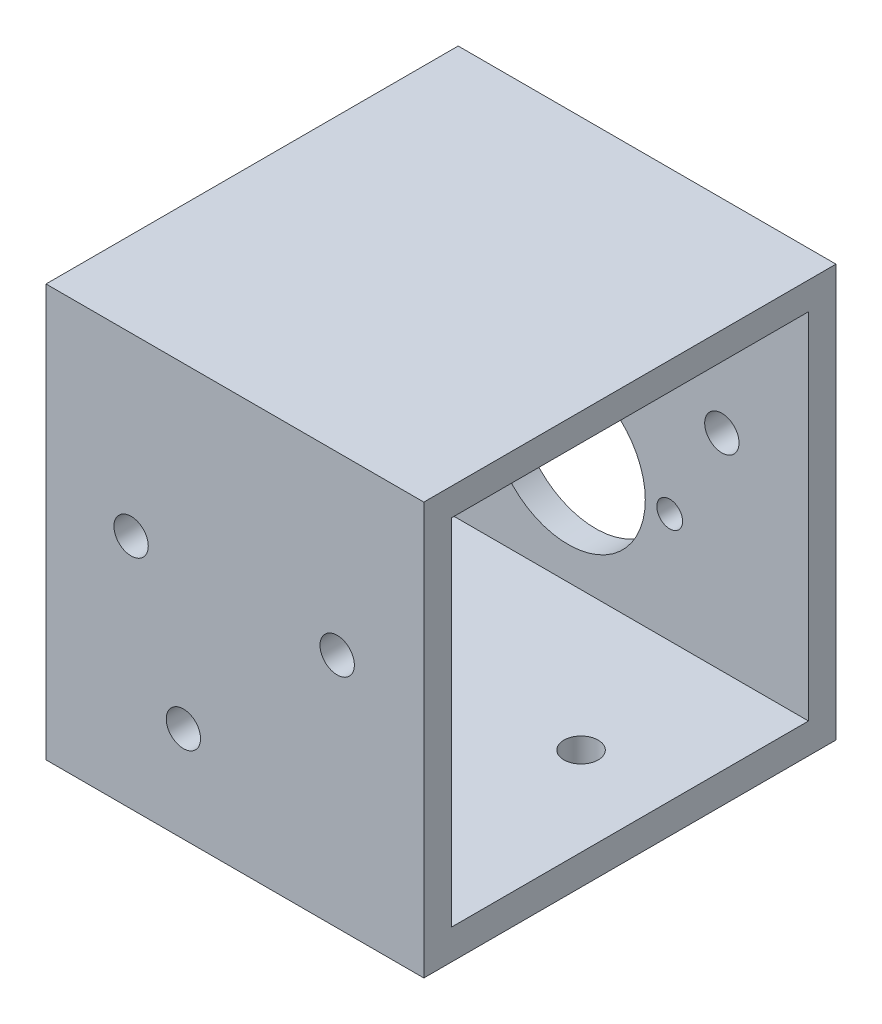
ISO-10303-21;
HEADER;
FILE_DESCRIPTION(('STEP AP214'),'2;1');
FILE_NAME('part.step','',(''),(''),'','','');
FILE_SCHEMA(('AUTOMOTIVE_DESIGN { 1 0 10303 214 1 1 1 1 }'));
ENDSEC;
DATA;
#1=APPLICATION_CONTEXT('core data for automotive mechanical design processes');
#2=APPLICATION_PROTOCOL_DEFINITION('international standard','automotive_design',2000,#1);
#3=PRODUCT_CONTEXT('',#1,'mechanical');
#4=PRODUCT('Part','Part','',(#3));
#5=PRODUCT_RELATED_PRODUCT_CATEGORY('part','',(#4));
#6=PRODUCT_DEFINITION_FORMATION('','',#4);
#7=PRODUCT_DEFINITION_CONTEXT('part definition',#1,'design');
#8=PRODUCT_DEFINITION('design','',#6,#7);
#9=PRODUCT_DEFINITION_SHAPE('','',#8);
#10=(LENGTH_UNIT() NAMED_UNIT(*) SI_UNIT(.MILLI.,.METRE.));
#11=(NAMED_UNIT(*) PLANE_ANGLE_UNIT() SI_UNIT($,.RADIAN.));
#12=(NAMED_UNIT(*) SI_UNIT($,.STERADIAN.) SOLID_ANGLE_UNIT());
#13=UNCERTAINTY_MEASURE_WITH_UNIT(LENGTH_MEASURE(1.E-05),#10,'distance_accuracy_value','');
#14=(GEOMETRIC_REPRESENTATION_CONTEXT(3) GLOBAL_UNCERTAINTY_ASSIGNED_CONTEXT((#13)) GLOBAL_UNIT_ASSIGNED_CONTEXT((#10,
#11,#12)) REPRESENTATION_CONTEXT('',''));
#15=CARTESIAN_POINT('',(0.,0.,0.));
#16=DIRECTION('',(0.,0.,1.));
#17=DIRECTION('',(1.,0.,0.));
#18=AXIS2_PLACEMENT_3D('',#15,#16,#17);
#19=CARTESIAN_POINT('',(44.45,-25.9079999999999,3.81));
#20=DIRECTION('',(0.,0.,1.));
#21=DIRECTION('',(1.,0.,0.));
#22=AXIS2_PLACEMENT_3D('',#19,#20,#21);
#23=PLANE('',#22);
#24=CARTESIAN_POINT('',(-9.66913696650162,17.7799999999995,3.81));
#25=DIRECTION('',(0.,0.,1.));
#26=DIRECTION('',(1.,0.,0.));
#27=AXIS2_PLACEMENT_3D('',#24,#25,#26);
#28=CIRCLE('',#27,3.175);
#29=CARTESIAN_POINT('',(-6.49413696650162,17.7799999999995,3.81));
#30=VERTEX_POINT('',#29);
#31=EDGE_CURVE('E306',#30,#30,#28,.T.);
#32=ORIENTED_EDGE('',*,*,#31,.F.);
#33=EDGE_LOOP('',(#32));
#34=FACE_BOUND('',#33,.T.);
#35=CARTESIAN_POINT('',(28.4308630334944,17.7799999999995,3.81));
#36=DIRECTION('',(0.,0.,1.));
#37=DIRECTION('',(1.,0.,0.));
#38=AXIS2_PLACEMENT_3D('',#35,#36,#37);
#39=CIRCLE('',#38,3.175);
#40=CARTESIAN_POINT('',(31.6058630334944,17.7799999999995,3.81));
#41=VERTEX_POINT('',#40);
#42=EDGE_CURVE('E157',#41,#41,#39,.T.);
#43=ORIENTED_EDGE('',*,*,#42,.F.);
#44=EDGE_LOOP('',(#43));
#45=FACE_BOUND('',#44,.T.);
#46=CARTESIAN_POINT('',(18.7833,0.,3.81));
#47=DIRECTION('',(0.,0.,1.));
#48=DIRECTION('',(1.,0.,0.));
#49=AXIS2_PLACEMENT_3D('',#46,#47,#48);
#50=CIRCLE('',#49,2.3876);
#51=CARTESIAN_POINT('',(21.1709,0.,3.81));
#52=VERTEX_POINT('',#51);
#53=EDGE_CURVE('E179',#52,#52,#50,.T.);
#54=ORIENTED_EDGE('',*,*,#53,.F.);
#55=EDGE_LOOP('',(#54));
#56=FACE_BOUND('',#55,.T.);
#57=CARTESIAN_POINT('',(0.,0.,3.81));
#58=DIRECTION('',(0.,0.,1.));
#59=DIRECTION('',(1.,0.,0.));
#60=AXIS2_PLACEMENT_3D('',#57,#58,#59);
#61=CIRCLE('',#60,14.2748);
#62=CARTESIAN_POINT('',(14.2748,0.,3.81));
#63=VERTEX_POINT('',#62);
#64=EDGE_CURVE('E183',#63,#63,#61,.T.);
#65=ORIENTED_EDGE('',*,*,#64,.F.);
#66=EDGE_LOOP('',(#65));
#67=FACE_BOUND('',#66,.T.);
#68=CARTESIAN_POINT('',(-18.7833,0.,3.81));
#69=DIRECTION('',(0.,0.,1.));
#70=DIRECTION('',(1.,0.,0.));
#71=AXIS2_PLACEMENT_3D('',#68,#69,#70);
#72=CIRCLE('',#71,2.3876);
#73=CARTESIAN_POINT('',(-16.3957,0.,3.81));
#74=VERTEX_POINT('',#73);
#75=EDGE_CURVE('E175',#74,#74,#72,.T.);
#76=ORIENTED_EDGE('',*,*,#75,.F.);
#77=EDGE_LOOP('',(#76));
#78=FACE_BOUND('',#77,.T.);
#79=DIRECTION('',(0.,-1.,0.));
#80=VECTOR('',#79,1.);
#81=CARTESIAN_POINT('',(-25.4,43.9420000000001,3.81));
#82=LINE('',#81,#80);
#83=CARTESIAN_POINT('',(-25.4,45.2120000000001,3.81));
#84=VERTEX_POINT('',#83);
#85=CARTESIAN_POINT('',(-25.4,-20.32,3.81));
#86=VERTEX_POINT('',#85);
#87=EDGE_CURVE('E162',#84,#86,#82,.T.);
#88=ORIENTED_EDGE('',*,*,#87,.T.);
#89=DIRECTION('',(-1.,0.,0.));
#90=VECTOR('',#89,1.);
#91=CARTESIAN_POINT('',(-25.4,-20.32,3.81));
#92=LINE('',#91,#90);
#93=CARTESIAN_POINT('',(44.45,-20.32,3.81));
#94=VERTEX_POINT('',#93);
#95=EDGE_CURVE('E139',#94,#86,#92,.T.);
#96=ORIENTED_EDGE('',*,*,#95,.F.);
#97=DIRECTION('',(0.,1.,0.));
#98=VECTOR('',#97,1.);
#99=CARTESIAN_POINT('',(44.45,50.2920000000001,3.81));
#100=LINE('',#99,#98);
#101=CARTESIAN_POINT('',(44.45,45.2120000000001,3.81));
#102=VERTEX_POINT('',#101);
#103=EDGE_CURVE('E39',#94,#102,#100,.T.);
#104=ORIENTED_EDGE('',*,*,#103,.T.);
#105=DIRECTION('',(1.,0.,0.));
#106=VECTOR('',#105,1.);
#107=CARTESIAN_POINT('',(-25.4,45.2120000000001,3.81));
#108=LINE('',#107,#106);
#109=EDGE_CURVE('E61',#84,#102,#108,.T.);
#110=ORIENTED_EDGE('',*,*,#109,.F.);
#111=EDGE_LOOP('',(#88,#96,#104,#110));
#112=FACE_BOUND('',#111,.T.);
#113=ADVANCED_FACE('F35',(#34,#45,#56,#67,#78,#112),#23,.T.);
#114=CARTESIAN_POINT('',(44.45,-25.9079999999999,-1.27));
#115=DIRECTION('',(1.,0.,0.));
#116=DIRECTION('',(0.,1.,0.));
#117=AXIS2_PLACEMENT_3D('',#114,#115,#116);
#118=PLANE('',#117);
#119=DIRECTION('',(0.,0.,1.));
#120=VECTOR('',#119,1.);
#121=CARTESIAN_POINT('',(44.45,50.2920000000001,-1.27));
#122=LINE('',#121,#120);
#123=CARTESIAN_POINT('',(44.45,50.2920000000001,-1.27));
#124=VERTEX_POINT('',#123);
#125=CARTESIAN_POINT('',(44.45,50.2920000000001,74.93));
#126=VERTEX_POINT('',#125);
#127=EDGE_CURVE('E210',#124,#126,#122,.T.);
#128=ORIENTED_EDGE('',*,*,#127,.T.);
#129=DIRECTION('',(0.,1.,0.));
#130=VECTOR('',#129,1.);
#131=CARTESIAN_POINT('',(44.45,50.2920000000001,74.93));
#132=LINE('',#131,#130);
#133=CARTESIAN_POINT('',(44.45,-25.9079999999999,74.93));
#134=VERTEX_POINT('',#133);
#135=EDGE_CURVE('E121',#134,#126,#132,.T.);
#136=ORIENTED_EDGE('',*,*,#135,.F.);
#137=DIRECTION('',(0.,0.,1.));
#138=VECTOR('',#137,1.);
#139=CARTESIAN_POINT('',(44.45,-25.9079999999999,-1.27));
#140=LINE('',#139,#138);
#141=CARTESIAN_POINT('',(44.45,-25.9079999999999,-1.27));
#142=VERTEX_POINT('',#141);
#143=EDGE_CURVE('E11',#142,#134,#140,.T.);
#144=ORIENTED_EDGE('',*,*,#143,.F.);
#145=DIRECTION('',(0.,1.,0.));
#146=VECTOR('',#145,1.);
#147=CARTESIAN_POINT('',(44.45,50.2920000000001,-1.27));
#148=LINE('',#147,#146);
#149=EDGE_CURVE('E202',#142,#124,#148,.T.);
#150=ORIENTED_EDGE('',*,*,#149,.T.);
#151=EDGE_LOOP('',(#128,#136,#144,#150));
#152=FACE_BOUND('',#151,.T.);
#153=DIRECTION('',(0.,1.,0.));
#154=VECTOR('',#153,1.);
#155=CARTESIAN_POINT('',(44.45,50.2920000000001,69.85));
#156=LINE('',#155,#154);
#157=CARTESIAN_POINT('',(44.45,-20.32,69.85));
#158=VERTEX_POINT('',#157);
#159=CARTESIAN_POINT('',(44.45,45.2120000000001,69.85));
#160=VERTEX_POINT('',#159);
#161=EDGE_CURVE('E128',#158,#160,#156,.T.);
#162=ORIENTED_EDGE('',*,*,#161,.T.);
#163=DIRECTION('',(0.,0.,-1.));
#164=VECTOR('',#163,1.);
#165=CARTESIAN_POINT('',(44.45,45.2120000000001,69.85));
#166=LINE('',#165,#164);
#167=EDGE_CURVE('E154',#160,#102,#166,.T.);
#168=ORIENTED_EDGE('',*,*,#167,.T.);
#169=ORIENTED_EDGE('',*,*,#103,.F.);
#170=DIRECTION('',(0.,0.,-1.));
#171=VECTOR('',#170,1.);
#172=CARTESIAN_POINT('',(44.45,-20.32,69.85));
#173=LINE('',#172,#171);
#174=EDGE_CURVE('E53',#158,#94,#173,.T.);
#175=ORIENTED_EDGE('',*,*,#174,.F.);
#176=EDGE_LOOP('',(#162,#168,#169,#175));
#177=FACE_BOUND('',#176,.T.);
#178=ADVANCED_FACE('F213',(#152,#177),#118,.T.);
#179=CARTESIAN_POINT('',(-25.4,-25.9079999999999,-1.27));
#180=DIRECTION('',(0.,-1.,0.));
#181=DIRECTION('',(0.,0.,-1.));
#182=AXIS2_PLACEMENT_3D('',#179,#180,#181);
#183=PLANE('',#182);
#184=CARTESIAN_POINT('',(28.0687705751946,-25.9079999999999,29.4787842216814));
#185=DIRECTION('',(0.,-1.,0.));
#186=DIRECTION('',(0.,0.,-1.));
#187=AXIS2_PLACEMENT_3D('',#184,#185,#186);
#188=CIRCLE('',#187,3.17499999887452);
#189=CARTESIAN_POINT('',(28.0687705751946,-25.9079999999999,26.3037842228069));
#190=VERTEX_POINT('',#189);
#191=EDGE_CURVE('E321',#190,#190,#188,.T.);
#192=ORIENTED_EDGE('',*,*,#191,.F.);
#193=EDGE_LOOP('',(#192));
#194=FACE_BOUND('',#193,.T.);
#195=ORIENTED_EDGE('',*,*,#143,.T.);
#196=DIRECTION('',(1.,0.,0.));
#197=VECTOR('',#196,1.);
#198=CARTESIAN_POINT('',(-25.4,-25.9079999999999,74.93));
#199=LINE('',#198,#197);
#200=CARTESIAN_POINT('',(-25.4,-25.9079999999999,74.93));
#201=VERTEX_POINT('',#200);
#202=EDGE_CURVE('E115',#201,#134,#199,.T.);
#203=ORIENTED_EDGE('',*,*,#202,.F.);
#204=DIRECTION('',(0.,0.,1.));
#205=VECTOR('',#204,1.);
#206=CARTESIAN_POINT('',(-25.4,-25.9079999999999,-1.27));
#207=LINE('',#206,#205);
#208=CARTESIAN_POINT('',(-25.4,-25.9079999999999,-1.27));
#209=VERTEX_POINT('',#208);
#210=EDGE_CURVE('E45',#209,#201,#207,.T.);
#211=ORIENTED_EDGE('',*,*,#210,.F.);
#212=DIRECTION('',(1.,0.,0.));
#213=VECTOR('',#212,1.);
#214=CARTESIAN_POINT('',(-25.4,-25.9079999999999,-1.27));
#215=LINE('',#214,#213);
#216=EDGE_CURVE('E209',#209,#142,#215,.T.);
#217=ORIENTED_EDGE('',*,*,#216,.T.);
#218=EDGE_LOOP('',(#195,#203,#211,#217));
#219=FACE_BOUND('',#218,.T.);
#220=ADVANCED_FACE('F116',(#194,#219),#183,.T.);
#221=CARTESIAN_POINT('',(-25.4,-25.9079999999999,-1.27));
#222=DIRECTION('',(-1.,0.,0.));
#223=DIRECTION('',(0.,0.,1.));
#224=AXIS2_PLACEMENT_3D('',#221,#222,#223);
#225=PLANE('',#224);
#226=DIRECTION('',(0.,0.,-1.));
#227=VECTOR('',#226,1.);
#228=CARTESIAN_POINT('',(-25.4,45.2120000000001,69.85));
#229=LINE('',#228,#227);
#230=CARTESIAN_POINT('',(-25.4,45.2120000000001,69.85));
#231=VERTEX_POINT('',#230);
#232=EDGE_CURVE('E167',#231,#84,#229,.T.);
#233=ORIENTED_EDGE('',*,*,#232,.F.);
#234=DIRECTION('',(0.,-1.,0.));
#235=VECTOR('',#234,1.);
#236=CARTESIAN_POINT('',(-25.4,50.2920000000001,69.85));
#237=LINE('',#236,#235);
#238=CARTESIAN_POINT('',(-25.4,-20.32,69.85));
#239=VERTEX_POINT('',#238);
#240=EDGE_CURVE('E131',#231,#239,#237,.T.);
#241=ORIENTED_EDGE('',*,*,#240,.T.);
#242=DIRECTION('',(0.,0.,-1.));
#243=VECTOR('',#242,1.);
#244=CARTESIAN_POINT('',(-25.4,-20.32,69.85));
#245=LINE('',#244,#243);
#246=EDGE_CURVE('E146',#239,#86,#245,.T.);
#247=ORIENTED_EDGE('',*,*,#246,.T.);
#248=ORIENTED_EDGE('',*,*,#87,.F.);
#249=EDGE_LOOP('',(#233,#241,#247,#248));
#250=FACE_BOUND('',#249,.T.);
#251=ORIENTED_EDGE('',*,*,#210,.T.);
#252=DIRECTION('',(0.,-1.,0.));
#253=VECTOR('',#252,1.);
#254=CARTESIAN_POINT('',(-25.4,50.2920000000001,74.93));
#255=LINE('',#254,#253);
#256=CARTESIAN_POINT('',(-25.4,50.2920000000001,74.93));
#257=VERTEX_POINT('',#256);
#258=EDGE_CURVE('E106',#257,#201,#255,.T.);
#259=ORIENTED_EDGE('',*,*,#258,.F.);
#260=DIRECTION('',(0.,0.,1.));
#261=VECTOR('',#260,1.);
#262=CARTESIAN_POINT('',(-25.4,50.2920000000001,-1.27));
#263=LINE('',#262,#261);
#264=CARTESIAN_POINT('',(-25.4,50.2920000000001,-1.27));
#265=VERTEX_POINT('',#264);
#266=EDGE_CURVE('E112',#265,#257,#263,.T.);
#267=ORIENTED_EDGE('',*,*,#266,.F.);
#268=DIRECTION('',(0.,-1.,0.));
#269=VECTOR('',#268,1.);
#270=CARTESIAN_POINT('',(-25.4,43.9420000000001,-1.27));
#271=LINE('',#270,#269);
#272=EDGE_CURVE('E108',#265,#209,#271,.T.);
#273=ORIENTED_EDGE('',*,*,#272,.T.);
#274=EDGE_LOOP('',(#251,#259,#267,#273));
#275=FACE_BOUND('',#274,.T.);
#276=ADVANCED_FACE('F104',(#250,#275),#225,.T.);
#277=CARTESIAN_POINT('',(-25.4,50.2920000000001,-1.27));
#278=DIRECTION('',(0.,1.,0.));
#279=DIRECTION('',(0.,0.,1.));
#280=AXIS2_PLACEMENT_3D('',#277,#278,#279);
#281=PLANE('',#280);
#282=ORIENTED_EDGE('',*,*,#266,.T.);
#283=DIRECTION('',(-1.,0.,0.));
#284=VECTOR('',#283,1.);
#285=CARTESIAN_POINT('',(-25.4,50.2920000000001,74.93));
#286=LINE('',#285,#284);
#287=EDGE_CURVE('E127',#126,#257,#286,.T.);
#288=ORIENTED_EDGE('',*,*,#287,.F.);
#289=ORIENTED_EDGE('',*,*,#127,.F.);
#290=DIRECTION('',(-1.,0.,0.));
#291=VECTOR('',#290,1.);
#292=CARTESIAN_POINT('',(-25.4,50.2920000000001,-1.27));
#293=LINE('',#292,#291);
#294=EDGE_CURVE('E205',#124,#265,#293,.T.);
#295=ORIENTED_EDGE('',*,*,#294,.T.);
#296=EDGE_LOOP('',(#282,#288,#289,#295));
#297=FACE_BOUND('',#296,.T.);
#298=ADVANCED_FACE('F37',(#297),#281,.T.);
#299=CARTESIAN_POINT('',(44.45,-25.9079999999999,-1.27));
#300=DIRECTION('',(0.,0.,1.));
#301=DIRECTION('',(1.,0.,0.));
#302=AXIS2_PLACEMENT_3D('',#299,#300,#301);
#303=PLANE('',#302);
#304=CARTESIAN_POINT('',(-9.66913696650162,17.7799999999995,-1.26999999999999));
#305=DIRECTION('',(0.,0.,1.));
#306=DIRECTION('',(1.,0.,0.));
#307=AXIS2_PLACEMENT_3D('',#304,#305,#306);
#308=CIRCLE('',#307,3.175);
#309=CARTESIAN_POINT('',(-6.49413696650162,17.7799999999995,-1.26999999999999));
#310=VERTEX_POINT('',#309);
#311=EDGE_CURVE('E308',#310,#310,#308,.T.);
#312=ORIENTED_EDGE('',*,*,#311,.T.);
#313=EDGE_LOOP('',(#312));
#314=FACE_BOUND('',#313,.T.);
#315=CARTESIAN_POINT('',(28.4308630334944,17.7799999999995,-1.27));
#316=DIRECTION('',(0.,0.,1.));
#317=DIRECTION('',(1.,0.,0.));
#318=AXIS2_PLACEMENT_3D('',#315,#316,#317);
#319=CIRCLE('',#318,3.175);
#320=CARTESIAN_POINT('',(31.6058630334944,17.7799999999995,-1.27));
#321=VERTEX_POINT('',#320);
#322=EDGE_CURVE('E190',#321,#321,#319,.T.);
#323=ORIENTED_EDGE('',*,*,#322,.T.);
#324=EDGE_LOOP('',(#323));
#325=FACE_BOUND('',#324,.T.);
#326=CARTESIAN_POINT('',(-18.7833,0.,-1.27));
#327=DIRECTION('',(0.,0.,1.));
#328=DIRECTION('',(1.,0.,0.));
#329=AXIS2_PLACEMENT_3D('',#326,#327,#328);
#330=CIRCLE('',#329,2.3876);
#331=CARTESIAN_POINT('',(-16.3957,0.,-1.27));
#332=VERTEX_POINT('',#331);
#333=EDGE_CURVE('E193',#332,#332,#330,.T.);
#334=ORIENTED_EDGE('',*,*,#333,.T.);
#335=EDGE_LOOP('',(#334));
#336=FACE_BOUND('',#335,.T.);
#337=CARTESIAN_POINT('',(18.7833,0.,-1.27));
#338=DIRECTION('',(0.,0.,1.));
#339=DIRECTION('',(1.,0.,0.));
#340=AXIS2_PLACEMENT_3D('',#337,#338,#339);
#341=CIRCLE('',#340,2.3876);
#342=CARTESIAN_POINT('',(21.1709,0.,-1.27));
#343=VERTEX_POINT('',#342);
#344=EDGE_CURVE('E196',#343,#343,#341,.T.);
#345=ORIENTED_EDGE('',*,*,#344,.T.);
#346=EDGE_LOOP('',(#345));
#347=FACE_BOUND('',#346,.T.);
#348=CARTESIAN_POINT('',(0.,0.,-1.27));
#349=DIRECTION('',(0.,0.,1.));
#350=DIRECTION('',(1.,0.,0.));
#351=AXIS2_PLACEMENT_3D('',#348,#349,#350);
#352=CIRCLE('',#351,14.2748);
#353=CARTESIAN_POINT('',(14.2748,0.,-1.27));
#354=VERTEX_POINT('',#353);
#355=EDGE_CURVE('E199',#354,#354,#352,.T.);
#356=ORIENTED_EDGE('',*,*,#355,.T.);
#357=EDGE_LOOP('',(#356));
#358=FACE_BOUND('',#357,.T.);
#359=ORIENTED_EDGE('',*,*,#149,.F.);
#360=ORIENTED_EDGE('',*,*,#216,.F.);
#361=ORIENTED_EDGE('',*,*,#272,.F.);
#362=ORIENTED_EDGE('',*,*,#294,.F.);
#363=EDGE_LOOP('',(#359,#360,#361,#362));
#364=FACE_BOUND('',#363,.T.);
#365=ADVANCED_FACE('F218',(#314,#325,#336,#347,#358,#364),#303,.F.);
#366=CARTESIAN_POINT('',(0.,0.,-1.27));
#367=DIRECTION('',(0.,0.,1.));
#368=DIRECTION('',(1.,0.,0.));
#369=AXIS2_PLACEMENT_3D('',#366,#367,#368);
#370=CYLINDRICAL_SURFACE('',#369,14.2748);
#371=ORIENTED_EDGE('',*,*,#355,.F.);
#372=EDGE_LOOP('',(#371));
#373=FACE_BOUND('',#372,.T.);
#374=ORIENTED_EDGE('',*,*,#64,.T.);
#375=EDGE_LOOP('',(#374));
#376=FACE_BOUND('',#375,.T.);
#377=ADVANCED_FACE('F220',(#373,#376),#370,.F.);
#378=CARTESIAN_POINT('',(18.7833,0.,-1.27));
#379=DIRECTION('',(0.,0.,1.));
#380=DIRECTION('',(1.,0.,0.));
#381=AXIS2_PLACEMENT_3D('',#378,#379,#380);
#382=CYLINDRICAL_SURFACE('',#381,2.3876);
#383=ORIENTED_EDGE('',*,*,#344,.F.);
#384=EDGE_LOOP('',(#383));
#385=FACE_BOUND('',#384,.T.);
#386=ORIENTED_EDGE('',*,*,#53,.T.);
#387=EDGE_LOOP('',(#386));
#388=FACE_BOUND('',#387,.T.);
#389=ADVANCED_FACE('F227',(#385,#388),#382,.F.);
#390=CARTESIAN_POINT('',(-18.7833,0.,-1.27));
#391=DIRECTION('',(0.,0.,1.));
#392=DIRECTION('',(1.,0.,0.));
#393=AXIS2_PLACEMENT_3D('',#390,#391,#392);
#394=CYLINDRICAL_SURFACE('',#393,2.3876);
#395=ORIENTED_EDGE('',*,*,#333,.F.);
#396=EDGE_LOOP('',(#395));
#397=FACE_BOUND('',#396,.T.);
#398=ORIENTED_EDGE('',*,*,#75,.T.);
#399=EDGE_LOOP('',(#398));
#400=FACE_BOUND('',#399,.T.);
#401=ADVANCED_FACE('F248',(#397,#400),#394,.F.);
#402=CARTESIAN_POINT('',(28.4308630334944,17.7799999999995,-1.27));
#403=DIRECTION('',(0.,0.,1.));
#404=DIRECTION('',(1.,0.,0.));
#405=AXIS2_PLACEMENT_3D('',#402,#403,#404);
#406=CYLINDRICAL_SURFACE('',#405,3.175);
#407=ORIENTED_EDGE('',*,*,#322,.F.);
#408=EDGE_LOOP('',(#407));
#409=FACE_BOUND('',#408,.T.);
#410=ORIENTED_EDGE('',*,*,#42,.T.);
#411=EDGE_LOOP('',(#410));
#412=FACE_BOUND('',#411,.T.);
#413=ADVANCED_FACE('F245',(#409,#412),#406,.F.);
#414=CARTESIAN_POINT('',(-25.4,45.2120000000001,69.85));
#415=DIRECTION('',(0.,1.,0.));
#416=DIRECTION('',(0.,0.,1.));
#417=AXIS2_PLACEMENT_3D('',#414,#415,#416);
#418=PLANE('',#417);
#419=ORIENTED_EDGE('',*,*,#109,.T.);
#420=ORIENTED_EDGE('',*,*,#167,.F.);
#421=DIRECTION('',(1.,0.,0.));
#422=VECTOR('',#421,1.);
#423=CARTESIAN_POINT('',(-25.4,45.2120000000001,69.85));
#424=LINE('',#423,#422);
#425=EDGE_CURVE('E151',#231,#160,#424,.T.);
#426=ORIENTED_EDGE('',*,*,#425,.F.);
#427=ORIENTED_EDGE('',*,*,#232,.T.);
#428=EDGE_LOOP('',(#419,#420,#426,#427));
#429=FACE_BOUND('',#428,.T.);
#430=ADVANCED_FACE('F243',(#429),#418,.F.);
#431=CARTESIAN_POINT('',(-25.4,-20.32,69.85));
#432=DIRECTION('',(0.,-1.,0.));
#433=DIRECTION('',(0.,0.,-1.));
#434=AXIS2_PLACEMENT_3D('',#431,#432,#433);
#435=PLANE('',#434);
#436=CARTESIAN_POINT('',(28.0687705751946,-20.32,29.4787842216814));
#437=DIRECTION('',(0.,-1.,0.));
#438=DIRECTION('',(0.,0.,-1.));
#439=AXIS2_PLACEMENT_3D('',#436,#437,#438);
#440=CIRCLE('',#439,3.17499999887452);
#441=CARTESIAN_POINT('',(28.0687705751946,-20.32,26.3037842228069));
#442=VERTEX_POINT('',#441);
#443=EDGE_CURVE('E318',#442,#442,#440,.F.);
#444=ORIENTED_EDGE('',*,*,#443,.F.);
#445=EDGE_LOOP('',(#444));
#446=FACE_BOUND('',#445,.T.);
#447=ORIENTED_EDGE('',*,*,#95,.T.);
#448=ORIENTED_EDGE('',*,*,#246,.F.);
#449=DIRECTION('',(-1.,0.,0.));
#450=VECTOR('',#449,1.);
#451=CARTESIAN_POINT('',(-25.4,-20.32,69.85));
#452=LINE('',#451,#450);
#453=EDGE_CURVE('E143',#158,#239,#452,.T.);
#454=ORIENTED_EDGE('',*,*,#453,.F.);
#455=ORIENTED_EDGE('',*,*,#174,.T.);
#456=EDGE_LOOP('',(#447,#448,#454,#455));
#457=FACE_BOUND('',#456,.T.);
#458=ADVANCED_FACE('F270',(#446,#457),#435,.F.);
#459=CARTESIAN_POINT('',(-25.4,-25.9079999999999,69.85));
#460=DIRECTION('',(0.,0.,1.));
#461=DIRECTION('',(1.,0.,0.));
#462=AXIS2_PLACEMENT_3D('',#459,#460,#461);
#463=PLANE('',#462);
#464=CARTESIAN_POINT('',(-9.66913696650162,17.7799999999995,69.85));
#465=DIRECTION('',(0.,0.,1.));
#466=DIRECTION('',(1.,0.,0.));
#467=AXIS2_PLACEMENT_3D('',#464,#465,#466);
#468=CIRCLE('',#467,3.175);
#469=CARTESIAN_POINT('',(-6.49413696650162,17.7799999999995,69.85));
#470=VERTEX_POINT('',#469);
#471=EDGE_CURVE('E309',#470,#470,#468,.T.);
#472=ORIENTED_EDGE('',*,*,#471,.T.);
#473=EDGE_LOOP('',(#472));
#474=FACE_BOUND('',#473,.T.);
#475=CARTESIAN_POINT('',(28.4308630334984,17.78,69.85));
#476=DIRECTION('',(0.,0.,1.));
#477=DIRECTION('',(1.,0.,0.));
#478=AXIS2_PLACEMENT_3D('',#475,#476,#477);
#479=CIRCLE('',#478,3.17499999999992);
#480=CARTESIAN_POINT('',(31.6058630334983,17.78,69.85));
#481=VERTEX_POINT('',#480);
#482=EDGE_CURVE('E134',#481,#481,#479,.T.);
#483=ORIENTED_EDGE('',*,*,#482,.T.);
#484=EDGE_LOOP('',(#483));
#485=FACE_BOUND('',#484,.T.);
#486=CARTESIAN_POINT('',(0.,-8.22959999999999,69.85));
#487=DIRECTION('',(0.,0.,1.));
#488=DIRECTION('',(1.,0.,0.));
#489=AXIS2_PLACEMENT_3D('',#486,#487,#488);
#490=CIRCLE('',#489,3.175);
#491=CARTESIAN_POINT('',(3.175,-8.22959999999999,69.85));
#492=VERTEX_POINT('',#491);
#493=EDGE_CURVE('E324',#492,#492,#490,.T.);
#494=ORIENTED_EDGE('',*,*,#493,.T.);
#495=EDGE_LOOP('',(#494));
#496=FACE_BOUND('',#495,.T.);
#497=ORIENTED_EDGE('',*,*,#240,.F.);
#498=ORIENTED_EDGE('',*,*,#425,.T.);
#499=ORIENTED_EDGE('',*,*,#161,.F.);
#500=ORIENTED_EDGE('',*,*,#453,.T.);
#501=EDGE_LOOP('',(#497,#498,#499,#500));
#502=FACE_BOUND('',#501,.T.);
#503=ADVANCED_FACE('F269',(#474,#485,#496,#502),#463,.F.);
#504=CARTESIAN_POINT('',(-25.4,-25.9079999999999,74.93));
#505=DIRECTION('',(0.,0.,1.));
#506=DIRECTION('',(1.,0.,0.));
#507=AXIS2_PLACEMENT_3D('',#504,#505,#506);
#508=PLANE('',#507);
#509=CARTESIAN_POINT('',(-9.66913696650162,17.7799999999995,74.93));
#510=DIRECTION('',(0.,0.,1.));
#511=DIRECTION('',(1.,0.,0.));
#512=AXIS2_PLACEMENT_3D('',#509,#510,#511);
#513=CIRCLE('',#512,3.175);
#514=CARTESIAN_POINT('',(-6.49413696650162,17.7799999999995,74.93));
#515=VERTEX_POINT('',#514);
#516=EDGE_CURVE('E310',#515,#515,#513,.T.);
#517=ORIENTED_EDGE('',*,*,#516,.F.);
#518=EDGE_LOOP('',(#517));
#519=FACE_BOUND('',#518,.T.);
#520=CARTESIAN_POINT('',(28.4308630334984,17.78,74.93));
#521=DIRECTION('',(0.,0.,1.));
#522=DIRECTION('',(1.,0.,0.));
#523=AXIS2_PLACEMENT_3D('',#520,#521,#522);
#524=CIRCLE('',#523,3.17499999999992);
#525=CARTESIAN_POINT('',(31.6058630334983,17.78,74.93));
#526=VERTEX_POINT('',#525);
#527=EDGE_CURVE('E141',#526,#526,#524,.T.);
#528=ORIENTED_EDGE('',*,*,#527,.F.);
#529=EDGE_LOOP('',(#528));
#530=FACE_BOUND('',#529,.T.);
#531=ORIENTED_EDGE('',*,*,#258,.T.);
#532=ORIENTED_EDGE('',*,*,#202,.T.);
#533=ORIENTED_EDGE('',*,*,#135,.T.);
#534=ORIENTED_EDGE('',*,*,#287,.T.);
#535=EDGE_LOOP('',(#531,#532,#533,#534));
#536=FACE_BOUND('',#535,.T.);
#537=CARTESIAN_POINT('',(0.,-8.22959999999999,74.93));
#538=DIRECTION('',(0.,0.,1.));
#539=DIRECTION('',(1.,0.,0.));
#540=AXIS2_PLACEMENT_3D('',#537,#538,#539);
#541=CIRCLE('',#540,3.175);
#542=CARTESIAN_POINT('',(3.175,-8.22959999999999,74.93));
#543=VERTEX_POINT('',#542);
#544=EDGE_CURVE('E325',#543,#543,#541,.T.);
#545=ORIENTED_EDGE('',*,*,#544,.F.);
#546=EDGE_LOOP('',(#545));
#547=FACE_BOUND('',#546,.T.);
#548=ADVANCED_FACE('F124',(#519,#530,#536,#547),#508,.T.);
#549=CARTESIAN_POINT('',(28.4308630334984,17.78,74.93));
#550=DIRECTION('',(0.,0.,-1.));
#551=DIRECTION('',(-1.,0.,0.));
#552=AXIS2_PLACEMENT_3D('',#549,#550,#551);
#553=CYLINDRICAL_SURFACE('',#552,3.17499999999992);
#554=ORIENTED_EDGE('',*,*,#527,.T.);
#555=EDGE_LOOP('',(#554));
#556=FACE_BOUND('',#555,.T.);
#557=ORIENTED_EDGE('',*,*,#482,.F.);
#558=EDGE_LOOP('',(#557));
#559=FACE_BOUND('',#558,.T.);
#560=ADVANCED_FACE('F283',(#556,#559),#553,.F.);
#561=CARTESIAN_POINT('',(0.,-8.22959999999999,74.93));
#562=DIRECTION('',(0.,0.,-1.));
#563=DIRECTION('',(-1.,0.,0.));
#564=AXIS2_PLACEMENT_3D('',#561,#562,#563);
#565=CYLINDRICAL_SURFACE('',#564,3.175);
#566=ORIENTED_EDGE('',*,*,#544,.T.);
#567=EDGE_LOOP('',(#566));
#568=FACE_BOUND('',#567,.T.);
#569=ORIENTED_EDGE('',*,*,#493,.F.);
#570=EDGE_LOOP('',(#569));
#571=FACE_BOUND('',#570,.T.);
#572=ADVANCED_FACE('F287',(#568,#571),#565,.F.);
#573=CARTESIAN_POINT('',(28.0687705751946,50.2930000000001,29.4787842216814));
#574=DIRECTION('',(0.,-1.,0.));
#575=DIRECTION('',(0.,0.,-1.));
#576=AXIS2_PLACEMENT_3D('',#573,#574,#575);
#577=CYLINDRICAL_SURFACE('',#576,3.17499999887452);
#578=ORIENTED_EDGE('',*,*,#191,.T.);
#579=EDGE_LOOP('',(#578));
#580=FACE_BOUND('',#579,.T.);
#581=ORIENTED_EDGE('',*,*,#443,.T.);
#582=EDGE_LOOP('',(#581));
#583=FACE_BOUND('',#582,.T.);
#584=ADVANCED_FACE('F291',(#580,#583),#577,.F.);
#585=CARTESIAN_POINT('',(-9.66913696650162,17.7799999999995,-1.26999999999999));
#586=DIRECTION('',(0.,0.,1.));
#587=DIRECTION('',(1.,0.,0.));
#588=AXIS2_PLACEMENT_3D('',#585,#586,#587);
#589=CYLINDRICAL_SURFACE('',#588,3.175);
#590=ORIENTED_EDGE('',*,*,#516,.T.);
#591=EDGE_LOOP('',(#590));
#592=FACE_BOUND('',#591,.T.);
#593=ORIENTED_EDGE('',*,*,#471,.F.);
#594=EDGE_LOOP('',(#593));
#595=FACE_BOUND('',#594,.T.);
#596=ADVANCED_FACE('F295',(#592,#595),#589,.F.);
#597=ORIENTED_EDGE('',*,*,#31,.T.);
#598=EDGE_LOOP('',(#597));
#599=FACE_BOUND('',#598,.T.);
#600=ORIENTED_EDGE('',*,*,#311,.F.);
#601=EDGE_LOOP('',(#600));
#602=FACE_BOUND('',#601,.T.);
#603=ADVANCED_FACE('F297',(#599,#602),#589,.F.);
#604=CLOSED_SHELL('',(#113,#178,#220,#276,#298,#365,#377,#389,#401,#413,#430,#458,#503,#548,
#560,#572,#584,#596,#603));
#605=MANIFOLD_SOLID_BREP('B2',#604);
#606=ADVANCED_BREP_SHAPE_REPRESENTATION('',(#18,#605),#14);
#607=SHAPE_DEFINITION_REPRESENTATION(#9,#606);
ENDSEC;
END-ISO-10303-21;
